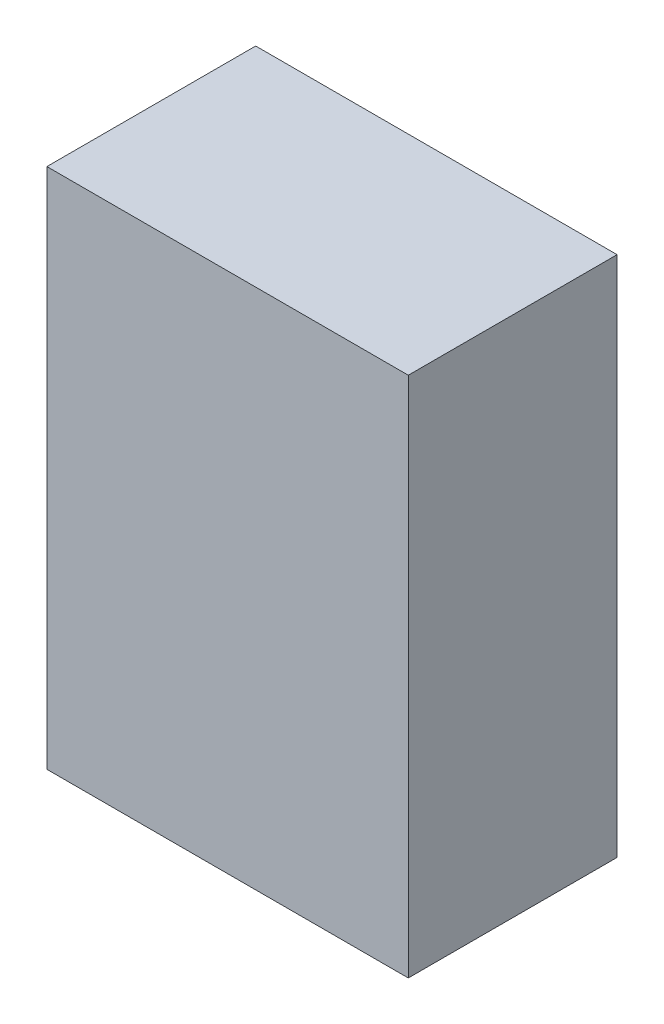
ISO-10303-21;
HEADER;
FILE_DESCRIPTION(('STEP AP214'),'2;1');
FILE_NAME('part.step','',(''),(''),'','','');
FILE_SCHEMA(('AUTOMOTIVE_DESIGN { 1 0 10303 214 1 1 1 1 }'));
ENDSEC;
DATA;
#1=APPLICATION_CONTEXT('core data for automotive mechanical design processes');
#2=APPLICATION_PROTOCOL_DEFINITION('international standard','automotive_design',2000,#1);
#3=PRODUCT_CONTEXT('',#1,'mechanical');
#4=PRODUCT('Part','Part','',(#3));
#5=PRODUCT_RELATED_PRODUCT_CATEGORY('part','',(#4));
#6=PRODUCT_DEFINITION_FORMATION('','',#4);
#7=PRODUCT_DEFINITION_CONTEXT('part definition',#1,'design');
#8=PRODUCT_DEFINITION('design','',#6,#7);
#9=PRODUCT_DEFINITION_SHAPE('','',#8);
#10=(LENGTH_UNIT() NAMED_UNIT(*) SI_UNIT(.MILLI.,.METRE.));
#11=(NAMED_UNIT(*) PLANE_ANGLE_UNIT() SI_UNIT($,.RADIAN.));
#12=(NAMED_UNIT(*) SI_UNIT($,.STERADIAN.) SOLID_ANGLE_UNIT());
#13=UNCERTAINTY_MEASURE_WITH_UNIT(LENGTH_MEASURE(1.E-05),#10,'distance_accuracy_value','');
#14=(GEOMETRIC_REPRESENTATION_CONTEXT(3) GLOBAL_UNCERTAINTY_ASSIGNED_CONTEXT((#13)) GLOBAL_UNIT_ASSIGNED_CONTEXT((#10,
#11,#12)) REPRESENTATION_CONTEXT('',''));
#15=CARTESIAN_POINT('',(0.,0.,0.));
#16=DIRECTION('',(0.,0.,1.));
#17=DIRECTION('',(1.,0.,0.));
#18=AXIS2_PLACEMENT_3D('',#15,#16,#17);
#19=CARTESIAN_POINT('',(0.,0.,26.));
#20=DIRECTION('',(1.,0.,0.));
#21=DIRECTION('',(0.,0.,-1.));
#22=AXIS2_PLACEMENT_3D('',#19,#20,#21);
#23=PLANE('',#22);
#24=DIRECTION('',(0.,-1.,0.));
#25=VECTOR('',#24,1.);
#26=CARTESIAN_POINT('',(0.,0.,0.));
#27=LINE('',#26,#25);
#28=CARTESIAN_POINT('',(0.,65.,0.));
#29=VERTEX_POINT('',#28);
#30=CARTESIAN_POINT('',(0.,0.,0.));
#31=VERTEX_POINT('',#30);
#32=EDGE_CURVE('E95',#29,#31,#27,.T.);
#33=ORIENTED_EDGE('',*,*,#32,.T.);
#34=DIRECTION('',(0.,0.,-1.));
#35=VECTOR('',#34,1.);
#36=CARTESIAN_POINT('',(0.,0.,26.));
#37=LINE('',#36,#35);
#38=CARTESIAN_POINT('',(0.,0.,26.));
#39=VERTEX_POINT('',#38);
#40=EDGE_CURVE('E11',#39,#31,#37,.T.);
#41=ORIENTED_EDGE('',*,*,#40,.F.);
#42=DIRECTION('',(0.,-1.,0.));
#43=VECTOR('',#42,1.);
#44=CARTESIAN_POINT('',(0.,0.,26.));
#45=LINE('',#44,#43);
#46=CARTESIAN_POINT('',(0.,65.,26.));
#47=VERTEX_POINT('',#46);
#48=EDGE_CURVE('E83',#47,#39,#45,.T.);
#49=ORIENTED_EDGE('',*,*,#48,.F.);
#50=DIRECTION('',(0.,0.,-1.));
#51=VECTOR('',#50,1.);
#52=CARTESIAN_POINT('',(0.,65.,26.));
#53=LINE('',#52,#51);
#54=EDGE_CURVE('E91',#47,#29,#53,.T.);
#55=ORIENTED_EDGE('',*,*,#54,.T.);
#56=EDGE_LOOP('',(#33,#41,#49,#55));
#57=FACE_BOUND('',#56,.T.);
#58=ADVANCED_FACE('F32',(#57),#23,.F.);
#59=CARTESIAN_POINT('',(0.,0.,26.));
#60=DIRECTION('',(0.,1.,0.));
#61=DIRECTION('',(0.,0.,1.));
#62=AXIS2_PLACEMENT_3D('',#59,#60,#61);
#63=PLANE('',#62);
#64=DIRECTION('',(1.,0.,0.));
#65=VECTOR('',#64,1.);
#66=CARTESIAN_POINT('',(0.,0.,0.));
#67=LINE('',#66,#65);
#68=CARTESIAN_POINT('',(45.,0.,0.));
#69=VERTEX_POINT('',#68);
#70=EDGE_CURVE('E87',#31,#69,#67,.T.);
#71=ORIENTED_EDGE('',*,*,#70,.T.);
#72=DIRECTION('',(0.,0.,-1.));
#73=VECTOR('',#72,1.);
#74=CARTESIAN_POINT('',(45.,0.,26.));
#75=LINE('',#74,#73);
#76=CARTESIAN_POINT('',(45.,0.,26.));
#77=VERTEX_POINT('',#76);
#78=EDGE_CURVE('E40',#77,#69,#75,.T.);
#79=ORIENTED_EDGE('',*,*,#78,.F.);
#80=DIRECTION('',(1.,0.,0.));
#81=VECTOR('',#80,1.);
#82=CARTESIAN_POINT('',(0.,0.,26.));
#83=LINE('',#82,#81);
#84=EDGE_CURVE('E78',#39,#77,#83,.T.);
#85=ORIENTED_EDGE('',*,*,#84,.F.);
#86=ORIENTED_EDGE('',*,*,#40,.T.);
#87=EDGE_LOOP('',(#71,#79,#85,#86));
#88=FACE_BOUND('',#87,.T.);
#89=ADVANCED_FACE('F86',(#88),#63,.F.);
#90=CARTESIAN_POINT('',(45.,0.,26.));
#91=DIRECTION('',(-1.,0.,0.));
#92=DIRECTION('',(0.,0.,1.));
#93=AXIS2_PLACEMENT_3D('',#90,#91,#92);
#94=PLANE('',#93);
#95=DIRECTION('',(0.,1.,0.));
#96=VECTOR('',#95,1.);
#97=CARTESIAN_POINT('',(45.,0.,0.));
#98=LINE('',#97,#96);
#99=CARTESIAN_POINT('',(45.,65.,0.));
#100=VERTEX_POINT('',#99);
#101=EDGE_CURVE('E65',#69,#100,#98,.T.);
#102=ORIENTED_EDGE('',*,*,#101,.T.);
#103=DIRECTION('',(0.,0.,-1.));
#104=VECTOR('',#103,1.);
#105=CARTESIAN_POINT('',(45.,65.,26.));
#106=LINE('',#105,#104);
#107=CARTESIAN_POINT('',(45.,65.,26.));
#108=VERTEX_POINT('',#107);
#109=EDGE_CURVE('E88',#108,#100,#106,.T.);
#110=ORIENTED_EDGE('',*,*,#109,.F.);
#111=DIRECTION('',(0.,1.,0.));
#112=VECTOR('',#111,1.);
#113=CARTESIAN_POINT('',(45.,0.,26.));
#114=LINE('',#113,#112);
#115=EDGE_CURVE('E81',#77,#108,#114,.T.);
#116=ORIENTED_EDGE('',*,*,#115,.F.);
#117=ORIENTED_EDGE('',*,*,#78,.T.);
#118=EDGE_LOOP('',(#102,#110,#116,#117));
#119=FACE_BOUND('',#118,.T.);
#120=ADVANCED_FACE('F89',(#119),#94,.F.);
#121=CARTESIAN_POINT('',(0.,65.,26.));
#122=DIRECTION('',(0.,-1.,0.));
#123=DIRECTION('',(0.,0.,-1.));
#124=AXIS2_PLACEMENT_3D('',#121,#122,#123);
#125=PLANE('',#124);
#126=DIRECTION('',(-1.,0.,0.));
#127=VECTOR('',#126,1.);
#128=CARTESIAN_POINT('',(0.,65.,0.));
#129=LINE('',#128,#127);
#130=EDGE_CURVE('E71',#100,#29,#129,.T.);
#131=ORIENTED_EDGE('',*,*,#130,.T.);
#132=ORIENTED_EDGE('',*,*,#54,.F.);
#133=DIRECTION('',(-1.,0.,0.));
#134=VECTOR('',#133,1.);
#135=CARTESIAN_POINT('',(0.,65.,26.));
#136=LINE('',#135,#134);
#137=EDGE_CURVE('E48',#108,#47,#136,.T.);
#138=ORIENTED_EDGE('',*,*,#137,.F.);
#139=ORIENTED_EDGE('',*,*,#109,.T.);
#140=EDGE_LOOP('',(#131,#132,#138,#139));
#141=FACE_BOUND('',#140,.T.);
#142=ADVANCED_FACE('F102',(#141),#125,.F.);
#143=CARTESIAN_POINT('',(0.,0.,26.));
#144=DIRECTION('',(0.,0.,-1.));
#145=DIRECTION('',(-1.,0.,0.));
#146=AXIS2_PLACEMENT_3D('',#143,#144,#145);
#147=PLANE('',#146);
#148=ORIENTED_EDGE('',*,*,#48,.T.);
#149=ORIENTED_EDGE('',*,*,#84,.T.);
#150=ORIENTED_EDGE('',*,*,#115,.T.);
#151=ORIENTED_EDGE('',*,*,#137,.T.);
#152=EDGE_LOOP('',(#148,#149,#150,#151));
#153=FACE_BOUND('',#152,.T.);
#154=ADVANCED_FACE('F79',(#153),#147,.F.);
#155=CARTESIAN_POINT('',(0.,0.,0.));
#156=DIRECTION('',(0.,0.,-1.));
#157=DIRECTION('',(-1.,0.,0.));
#158=AXIS2_PLACEMENT_3D('',#155,#156,#157);
#159=PLANE('',#158);
#160=ORIENTED_EDGE('',*,*,#32,.F.);
#161=ORIENTED_EDGE('',*,*,#130,.F.);
#162=ORIENTED_EDGE('',*,*,#101,.F.);
#163=ORIENTED_EDGE('',*,*,#70,.F.);
#164=EDGE_LOOP('',(#160,#161,#162,#163));
#165=FACE_BOUND('',#164,.T.);
#166=ADVANCED_FACE('F105',(#165),#159,.T.);
#167=CLOSED_SHELL('',(#58,#89,#120,#142,#154,#166));
#168=MANIFOLD_SOLID_BREP('B2',#167);
#169=ADVANCED_BREP_SHAPE_REPRESENTATION('',(#18,#168),#14);
#170=SHAPE_DEFINITION_REPRESENTATION(#9,#169);
ENDSEC;
END-ISO-10303-21;
